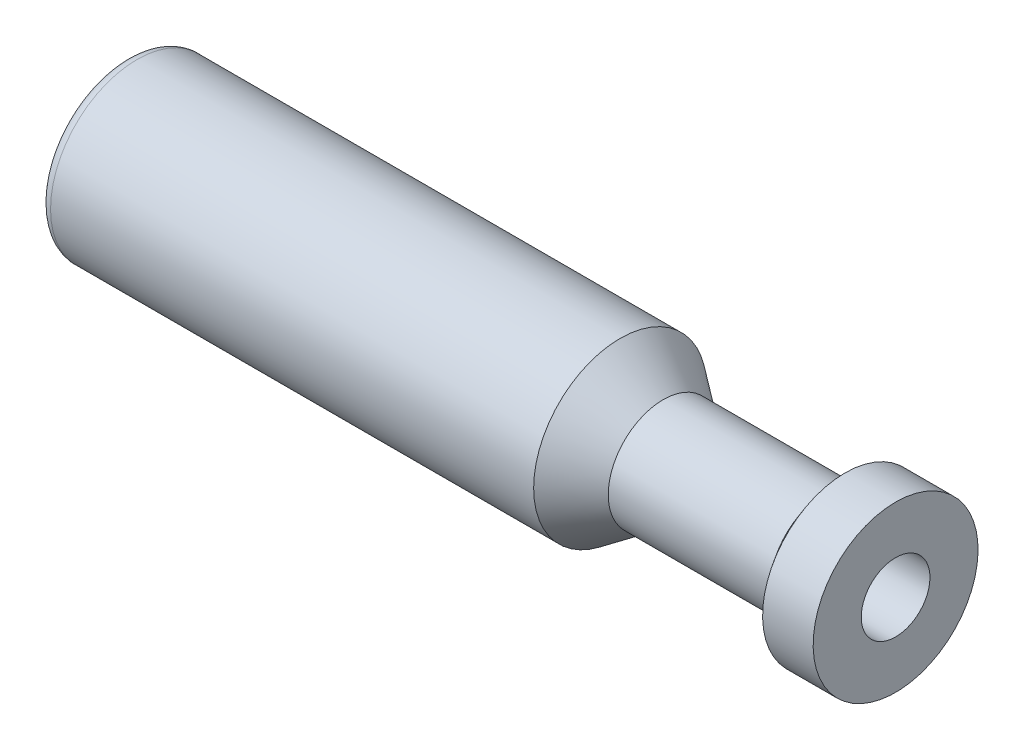
ISO-10303-21;
HEADER;
FILE_DESCRIPTION(('STEP AP214'),'2;1');
FILE_NAME('part.step','',(''),(''),'','','');
FILE_SCHEMA(('AUTOMOTIVE_DESIGN { 1 0 10303 214 1 1 1 1 }'));
ENDSEC;
DATA;
#1=APPLICATION_CONTEXT('core data for automotive mechanical design processes');
#2=APPLICATION_PROTOCOL_DEFINITION('international standard','automotive_design',2000,#1);
#3=PRODUCT_CONTEXT('',#1,'mechanical');
#4=PRODUCT('Part','Part','',(#3));
#5=PRODUCT_RELATED_PRODUCT_CATEGORY('part','',(#4));
#6=PRODUCT_DEFINITION_FORMATION('','',#4);
#7=PRODUCT_DEFINITION_CONTEXT('part definition',#1,'design');
#8=PRODUCT_DEFINITION('design','',#6,#7);
#9=PRODUCT_DEFINITION_SHAPE('','',#8);
#10=(LENGTH_UNIT() NAMED_UNIT(*) SI_UNIT(.MILLI.,.METRE.));
#11=(NAMED_UNIT(*) PLANE_ANGLE_UNIT() SI_UNIT($,.RADIAN.));
#12=(NAMED_UNIT(*) SI_UNIT($,.STERADIAN.) SOLID_ANGLE_UNIT());
#13=UNCERTAINTY_MEASURE_WITH_UNIT(LENGTH_MEASURE(1.E-05),#10,'distance_accuracy_value','');
#14=(GEOMETRIC_REPRESENTATION_CONTEXT(3) GLOBAL_UNCERTAINTY_ASSIGNED_CONTEXT((#13)) GLOBAL_UNIT_ASSIGNED_CONTEXT((#10,
#11,#12)) REPRESENTATION_CONTEXT('',''));
#15=CARTESIAN_POINT('',(0.,0.,0.));
#16=DIRECTION('',(0.,0.,1.));
#17=DIRECTION('',(1.,0.,0.));
#18=AXIS2_PLACEMENT_3D('',#15,#16,#17);
#19=CARTESIAN_POINT('',(171.145497315962,-54.9436031372152,0.));
#20=DIRECTION('',(1.,0.,0.));
#21=DIRECTION('',(0.,1.,0.));
#22=AXIS2_PLACEMENT_3D('',#19,#20,#21);
#23=CYLINDRICAL_SURFACE('',#22,19.9826775434751);
#24=CARTESIAN_POINT('',(-4.11450268403804,-54.9436031372152,0.));
#25=DIRECTION('',(-1.,0.,0.));
#26=DIRECTION('',(0.,-1.,0.));
#27=AXIS2_PLACEMENT_3D('',#24,#25,#26);
#28=CIRCLE('',#27,19.9826775434751);
#29=CARTESIAN_POINT('',(-4.11450268403804,-74.9262806806903,0.));
#30=VERTEX_POINT('',#29);
#31=EDGE_CURVE('E47',#30,#30,#28,.F.);
#32=ORIENTED_EDGE('',*,*,#31,.T.);
#33=EDGE_LOOP('',(#32));
#34=FACE_BOUND('',#33,.T.);
#35=CARTESIAN_POINT('',(107.503032850586,-54.9436031372152,0.));
#36=DIRECTION('',(1.,0.,0.));
#37=DIRECTION('',(0.,1.,0.));
#38=AXIS2_PLACEMENT_3D('',#35,#36,#37);
#39=CIRCLE('',#38,19.9826775434751);
#40=CARTESIAN_POINT('',(107.503032850586,-34.9609255937402,0.));
#41=VERTEX_POINT('',#40);
#42=EDGE_CURVE('E73',#41,#41,#39,.T.);
#43=ORIENTED_EDGE('',*,*,#42,.F.);
#44=EDGE_LOOP('',(#43));
#45=FACE_BOUND('',#44,.T.);
#46=ADVANCED_FACE('F39',(#34,#45),#23,.T.);
#47=CARTESIAN_POINT('',(-6.65450268403806,-34.9609255937402,0.));
#48=DIRECTION('',(-1.,0.,0.));
#49=DIRECTION('',(0.,-1.,0.));
#50=AXIS2_PLACEMENT_3D('',#47,#48,#49);
#51=PLANE('',#50);
#52=CARTESIAN_POINT('',(-6.65450268403805,-54.9436031372152,0.));
#53=DIRECTION('',(-1.,0.,0.));
#54=DIRECTION('',(0.,-1.,0.));
#55=AXIS2_PLACEMENT_3D('',#52,#53,#54);
#56=CIRCLE('',#55,17.4426775434751);
#57=CARTESIAN_POINT('',(-6.65450268403805,-72.3862806806903,0.));
#58=VERTEX_POINT('',#57);
#59=EDGE_CURVE('E10',#58,#58,#56,.T.);
#60=ORIENTED_EDGE('',*,*,#59,.T.);
#61=EDGE_LOOP('',(#60));
#62=FACE_BOUND('',#61,.T.);
#63=CARTESIAN_POINT('',(-6.65450268403805,-54.9436031372152,0.));
#64=DIRECTION('',(-1.,0.,0.));
#65=DIRECTION('',(0.,-1.,0.));
#66=AXIS2_PLACEMENT_3D('',#63,#64,#65);
#67=CIRCLE('',#66,7.9375);
#68=CARTESIAN_POINT('',(-6.65450268403805,-62.8811031372152,0.));
#69=VERTEX_POINT('',#68);
#70=EDGE_CURVE('E77',#69,#69,#67,.T.);
#71=ORIENTED_EDGE('',*,*,#70,.F.);
#72=EDGE_LOOP('',(#71));
#73=FACE_BOUND('',#72,.T.);
#74=ADVANCED_FACE('F93',(#62,#73),#51,.T.);
#75=CARTESIAN_POINT('',(171.145497315962,-35.8936031372152,0.));
#76=DIRECTION('',(1.,0.,0.));
#77=DIRECTION('',(0.,1.,0.));
#78=AXIS2_PLACEMENT_3D('',#75,#76,#77);
#79=PLANE('',#78);
#80=CARTESIAN_POINT('',(171.145497315962,-54.9436031372152,0.));
#81=DIRECTION('',(1.,0.,0.));
#82=DIRECTION('',(0.,1.,0.));
#83=AXIS2_PLACEMENT_3D('',#80,#81,#82);
#84=CIRCLE('',#83,7.9375);
#85=CARTESIAN_POINT('',(171.145497315962,-47.0061031372152,0.));
#86=VERTEX_POINT('',#85);
#87=EDGE_CURVE('E81',#86,#86,#84,.T.);
#88=ORIENTED_EDGE('',*,*,#87,.F.);
#89=EDGE_LOOP('',(#88));
#90=FACE_BOUND('',#89,.T.);
#91=CARTESIAN_POINT('',(171.145497315962,-54.9436031372152,0.));
#92=DIRECTION('',(1.,0.,0.));
#93=DIRECTION('',(0.,1.,0.));
#94=AXIS2_PLACEMENT_3D('',#91,#92,#93);
#95=CIRCLE('',#94,19.05);
#96=CARTESIAN_POINT('',(171.145497315962,-35.8936031372152,0.));
#97=VERTEX_POINT('',#96);
#98=EDGE_CURVE('E53',#97,#97,#95,.T.);
#99=ORIENTED_EDGE('',*,*,#98,.T.);
#100=EDGE_LOOP('',(#99));
#101=FACE_BOUND('',#100,.T.);
#102=ADVANCED_FACE('F89',(#90,#101),#79,.T.);
#103=CARTESIAN_POINT('',(171.145497315962,-54.9436031372152,0.));
#104=DIRECTION('',(1.,0.,0.));
#105=DIRECTION('',(0.,1.,0.));
#106=AXIS2_PLACEMENT_3D('',#103,#104,#105);
#107=CYLINDRICAL_SURFACE('',#106,19.05);
#108=CARTESIAN_POINT('',(159.466804827145,-54.9436031372152,0.));
#109=DIRECTION('',(1.,0.,0.));
#110=DIRECTION('',(0.,1.,0.));
#111=AXIS2_PLACEMENT_3D('',#108,#109,#110);
#112=CIRCLE('',#111,19.05);
#113=CARTESIAN_POINT('',(159.466804827145,-35.8936031372152,0.));
#114=VERTEX_POINT('',#113);
#115=EDGE_CURVE('E59',#114,#114,#112,.T.);
#116=ORIENTED_EDGE('',*,*,#115,.T.);
#117=EDGE_LOOP('',(#116));
#118=FACE_BOUND('',#117,.T.);
#119=ORIENTED_EDGE('',*,*,#98,.F.);
#120=EDGE_LOOP('',(#119));
#121=FACE_BOUND('',#120,.T.);
#122=ADVANCED_FACE('F92',(#118,#121),#107,.T.);
#123=CARTESIAN_POINT('',(159.466804827145,-54.9436031372152,0.));
#124=DIRECTION('',(1.,0.,0.));
#125=DIRECTION('',(0.,1.,0.));
#126=AXIS2_PLACEMENT_3D('',#123,#124,#125);
#127=CONICAL_SURFACE('',#126,19.05,0.938921702145992);
#128=CARTESIAN_POINT('',(154.818669260434,-54.9436031372152,0.));
#129=DIRECTION('',(1.,0.,0.));
#130=DIRECTION('',(0.,1.,0.));
#131=AXIS2_PLACEMENT_3D('',#128,#129,#130);
#132=CIRCLE('',#131,12.7);
#133=CARTESIAN_POINT('',(154.818669260434,-42.2436031372152,0.));
#134=VERTEX_POINT('',#133);
#135=EDGE_CURVE('E65',#134,#134,#132,.T.);
#136=ORIENTED_EDGE('',*,*,#135,.T.);
#137=EDGE_LOOP('',(#136));
#138=FACE_BOUND('',#137,.T.);
#139=ORIENTED_EDGE('',*,*,#115,.F.);
#140=EDGE_LOOP('',(#139));
#141=FACE_BOUND('',#140,.T.);
#142=ADVANCED_FACE('F98',(#138,#141),#127,.T.);
#143=CARTESIAN_POINT('',(171.145497315962,-54.9436031372152,0.));
#144=DIRECTION('',(1.,0.,0.));
#145=DIRECTION('',(0.,1.,0.));
#146=AXIS2_PLACEMENT_3D('',#143,#144,#145);
#147=CYLINDRICAL_SURFACE('',#146,12.7);
#148=CARTESIAN_POINT('',(117.452183803125,-54.9436031372152,0.));
#149=DIRECTION('',(1.,0.,0.));
#150=DIRECTION('',(0.,1.,0.));
#151=AXIS2_PLACEMENT_3D('',#148,#149,#150);
#152=CIRCLE('',#151,12.7);
#153=CARTESIAN_POINT('',(117.452183803125,-42.2436031372152,0.));
#154=VERTEX_POINT('',#153);
#155=EDGE_CURVE('E69',#154,#154,#152,.T.);
#156=ORIENTED_EDGE('',*,*,#155,.T.);
#157=EDGE_LOOP('',(#156));
#158=FACE_BOUND('',#157,.T.);
#159=ORIENTED_EDGE('',*,*,#135,.F.);
#160=EDGE_LOOP('',(#159));
#161=FACE_BOUND('',#160,.T.);
#162=ADVANCED_FACE('F104',(#158,#161),#147,.T.);
#163=CARTESIAN_POINT('',(117.452183803125,-54.9436031372152,0.));
#164=DIRECTION('',(-1.,0.,0.));
#165=DIRECTION('',(0.,-1.,0.));
#166=AXIS2_PLACEMENT_3D('',#163,#164,#165);
#167=CONICAL_SURFACE('',#166,12.7,0.631874624648905);
#168=ORIENTED_EDGE('',*,*,#42,.T.);
#169=EDGE_LOOP('',(#168));
#170=FACE_BOUND('',#169,.T.);
#171=ORIENTED_EDGE('',*,*,#155,.F.);
#172=EDGE_LOOP('',(#171));
#173=FACE_BOUND('',#172,.T.);
#174=ADVANCED_FACE('F115',(#170,#173),#167,.T.);
#175=CARTESIAN_POINT('',(-19.3545026840381,-54.9436031372152,0.));
#176=DIRECTION('',(1.,0.,0.));
#177=DIRECTION('',(0.,1.,0.));
#178=AXIS2_PLACEMENT_3D('',#175,#176,#177);
#179=CYLINDRICAL_SURFACE('',#178,7.9375);
#180=ORIENTED_EDGE('',*,*,#70,.T.);
#181=EDGE_LOOP('',(#180));
#182=FACE_BOUND('',#181,.T.);
#183=ORIENTED_EDGE('',*,*,#87,.T.);
#184=EDGE_LOOP('',(#183));
#185=FACE_BOUND('',#184,.T.);
#186=ADVANCED_FACE('F87',(#182,#185),#179,.F.);
#187=CARTESIAN_POINT('',(-4.11450268403804,-54.9436031372152,0.));
#188=DIRECTION('',(-1.,0.,0.));
#189=DIRECTION('',(0.,-1.,0.));
#190=AXIS2_PLACEMENT_3D('',#187,#188,#189);
#191=TOROIDAL_SURFACE('',#190,17.4426775434751,2.54);
#192=ORIENTED_EDGE('',*,*,#59,.F.);
#193=EDGE_LOOP('',(#192));
#194=FACE_BOUND('',#193,.T.);
#195=ORIENTED_EDGE('',*,*,#31,.F.);
#196=EDGE_LOOP('',(#195));
#197=FACE_BOUND('',#196,.T.);
#198=ADVANCED_FACE('F41',(#194,#197),#191,.T.);
#199=CLOSED_SHELL('',(#46,#74,#102,#122,#142,#162,#174,#186,#198));
#200=MANIFOLD_SOLID_BREP('B2',#199);
#201=ADVANCED_BREP_SHAPE_REPRESENTATION('',(#18,#200),#14);
#202=SHAPE_DEFINITION_REPRESENTATION(#9,#201);
ENDSEC;
END-ISO-10303-21;
